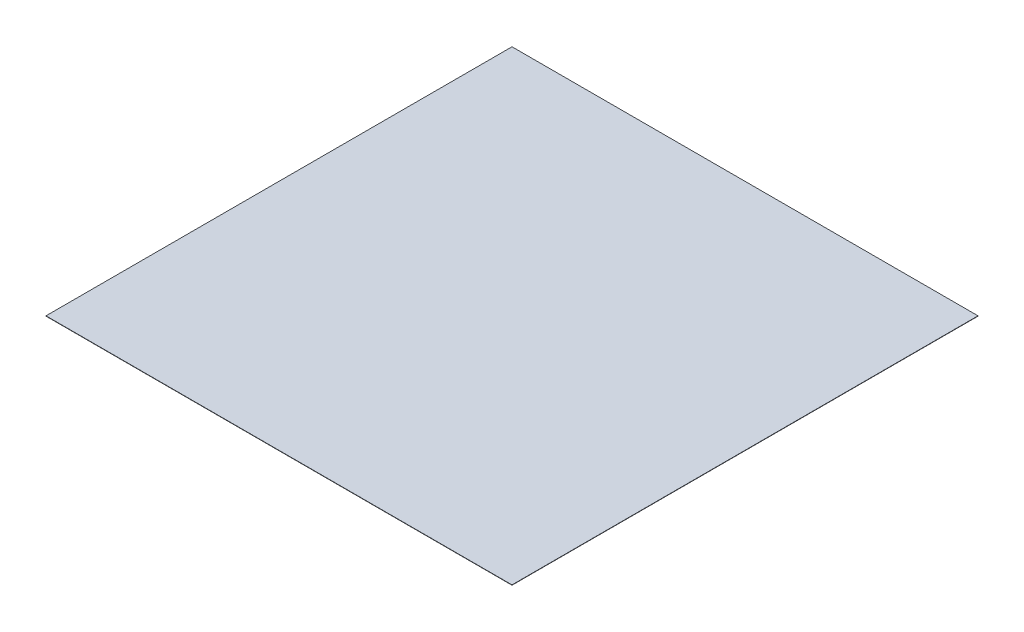
ISO-10303-21;
HEADER;
FILE_DESCRIPTION(('STEP AP214'),'2;1');
FILE_NAME('part.step','',(''),(''),'','','');
FILE_SCHEMA(('AUTOMOTIVE_DESIGN { 1 0 10303 214 1 1 1 1 }'));
ENDSEC;
DATA;
#1=APPLICATION_CONTEXT('core data for automotive mechanical design processes');
#2=APPLICATION_PROTOCOL_DEFINITION('international standard','automotive_design',2000,#1);
#3=PRODUCT_CONTEXT('',#1,'mechanical');
#4=PRODUCT('Part','Part','',(#3));
#5=PRODUCT_RELATED_PRODUCT_CATEGORY('part','',(#4));
#6=PRODUCT_DEFINITION_FORMATION('','',#4);
#7=PRODUCT_DEFINITION_CONTEXT('part definition',#1,'design');
#8=PRODUCT_DEFINITION('design','',#6,#7);
#9=PRODUCT_DEFINITION_SHAPE('','',#8);
#10=(LENGTH_UNIT() NAMED_UNIT(*) SI_UNIT(.MILLI.,.METRE.));
#11=(NAMED_UNIT(*) PLANE_ANGLE_UNIT() SI_UNIT($,.RADIAN.));
#12=(NAMED_UNIT(*) SI_UNIT($,.STERADIAN.) SOLID_ANGLE_UNIT());
#13=UNCERTAINTY_MEASURE_WITH_UNIT(LENGTH_MEASURE(1.E-05),#10,'distance_accuracy_value','');
#14=(GEOMETRIC_REPRESENTATION_CONTEXT(3) GLOBAL_UNCERTAINTY_ASSIGNED_CONTEXT((#13)) GLOBAL_UNIT_ASSIGNED_CONTEXT((#10,
#11,#12)) REPRESENTATION_CONTEXT('',''));
#15=CARTESIAN_POINT('',(0.,0.,0.));
#16=DIRECTION('',(0.,0.,1.));
#17=DIRECTION('',(1.,0.,0.));
#18=AXIS2_PLACEMENT_3D('',#15,#16,#17);
#19=CARTESIAN_POINT('',(47.625,0.065,47.625));
#20=DIRECTION('',(-1.,0.,0.));
#21=DIRECTION('',(0.,0.,1.));
#22=AXIS2_PLACEMENT_3D('',#19,#20,#21);
#23=PLANE('',#22);
#24=DIRECTION('',(0.,0.,-1.));
#25=VECTOR('',#24,1.);
#26=CARTESIAN_POINT('',(47.625,0.,47.625));
#27=LINE('',#26,#25);
#28=CARTESIAN_POINT('',(47.625,0.,47.625));
#29=VERTEX_POINT('',#28);
#30=CARTESIAN_POINT('',(47.625,0.,-47.625));
#31=VERTEX_POINT('',#30);
#32=EDGE_CURVE('E95',#29,#31,#27,.T.);
#33=ORIENTED_EDGE('',*,*,#32,.T.);
#34=DIRECTION('',(0.,-1.,0.));
#35=VECTOR('',#34,1.);
#36=CARTESIAN_POINT('',(47.625,0.065,-47.625));
#37=LINE('',#36,#35);
#38=CARTESIAN_POINT('',(47.625,0.065,-47.625));
#39=VERTEX_POINT('',#38);
#40=EDGE_CURVE('E11',#39,#31,#37,.T.);
#41=ORIENTED_EDGE('',*,*,#40,.F.);
#42=DIRECTION('',(0.,0.,-1.));
#43=VECTOR('',#42,1.);
#44=CARTESIAN_POINT('',(47.625,0.065,47.625));
#45=LINE('',#44,#43);
#46=CARTESIAN_POINT('',(47.625,0.065,47.625));
#47=VERTEX_POINT('',#46);
#48=EDGE_CURVE('E83',#47,#39,#45,.T.);
#49=ORIENTED_EDGE('',*,*,#48,.F.);
#50=DIRECTION('',(0.,-1.,0.));
#51=VECTOR('',#50,1.);
#52=CARTESIAN_POINT('',(47.625,0.065,47.625));
#53=LINE('',#52,#51);
#54=EDGE_CURVE('E91',#47,#29,#53,.T.);
#55=ORIENTED_EDGE('',*,*,#54,.T.);
#56=EDGE_LOOP('',(#33,#41,#49,#55));
#57=FACE_BOUND('',#56,.T.);
#58=ADVANCED_FACE('F32',(#57),#23,.F.);
#59=CARTESIAN_POINT('',(-47.625,0.065,-47.625));
#60=DIRECTION('',(0.,0.,1.));
#61=DIRECTION('',(1.,0.,0.));
#62=AXIS2_PLACEMENT_3D('',#59,#60,#61);
#63=PLANE('',#62);
#64=DIRECTION('',(-1.,0.,0.));
#65=VECTOR('',#64,1.);
#66=CARTESIAN_POINT('',(-47.625,0.,-47.625));
#67=LINE('',#66,#65);
#68=CARTESIAN_POINT('',(-47.625,0.,-47.625));
#69=VERTEX_POINT('',#68);
#70=EDGE_CURVE('E87',#31,#69,#67,.T.);
#71=ORIENTED_EDGE('',*,*,#70,.T.);
#72=DIRECTION('',(0.,-1.,0.));
#73=VECTOR('',#72,1.);
#74=CARTESIAN_POINT('',(-47.625,0.065,-47.625));
#75=LINE('',#74,#73);
#76=CARTESIAN_POINT('',(-47.625,0.065,-47.625));
#77=VERTEX_POINT('',#76);
#78=EDGE_CURVE('E40',#77,#69,#75,.T.);
#79=ORIENTED_EDGE('',*,*,#78,.F.);
#80=DIRECTION('',(-1.,0.,0.));
#81=VECTOR('',#80,1.);
#82=CARTESIAN_POINT('',(-47.625,0.065,-47.625));
#83=LINE('',#82,#81);
#84=EDGE_CURVE('E78',#39,#77,#83,.T.);
#85=ORIENTED_EDGE('',*,*,#84,.F.);
#86=ORIENTED_EDGE('',*,*,#40,.T.);
#87=EDGE_LOOP('',(#71,#79,#85,#86));
#88=FACE_BOUND('',#87,.T.);
#89=ADVANCED_FACE('F86',(#88),#63,.F.);
#90=CARTESIAN_POINT('',(-47.625,0.065,47.625));
#91=DIRECTION('',(1.,0.,0.));
#92=DIRECTION('',(0.,0.,-1.));
#93=AXIS2_PLACEMENT_3D('',#90,#91,#92);
#94=PLANE('',#93);
#95=DIRECTION('',(0.,0.,1.));
#96=VECTOR('',#95,1.);
#97=CARTESIAN_POINT('',(-47.625,0.,47.625));
#98=LINE('',#97,#96);
#99=CARTESIAN_POINT('',(-47.625,0.,47.625));
#100=VERTEX_POINT('',#99);
#101=EDGE_CURVE('E65',#69,#100,#98,.T.);
#102=ORIENTED_EDGE('',*,*,#101,.T.);
#103=DIRECTION('',(0.,-1.,0.));
#104=VECTOR('',#103,1.);
#105=CARTESIAN_POINT('',(-47.625,0.065,47.625));
#106=LINE('',#105,#104);
#107=CARTESIAN_POINT('',(-47.625,0.065,47.625));
#108=VERTEX_POINT('',#107);
#109=EDGE_CURVE('E88',#108,#100,#106,.T.);
#110=ORIENTED_EDGE('',*,*,#109,.F.);
#111=DIRECTION('',(0.,0.,1.));
#112=VECTOR('',#111,1.);
#113=CARTESIAN_POINT('',(-47.625,0.065,47.625));
#114=LINE('',#113,#112);
#115=EDGE_CURVE('E81',#77,#108,#114,.T.);
#116=ORIENTED_EDGE('',*,*,#115,.F.);
#117=ORIENTED_EDGE('',*,*,#78,.T.);
#118=EDGE_LOOP('',(#102,#110,#116,#117));
#119=FACE_BOUND('',#118,.T.);
#120=ADVANCED_FACE('F89',(#119),#94,.F.);
#121=CARTESIAN_POINT('',(-47.625,0.065,47.625));
#122=DIRECTION('',(0.,0.,-1.));
#123=DIRECTION('',(-1.,0.,0.));
#124=AXIS2_PLACEMENT_3D('',#121,#122,#123);
#125=PLANE('',#124);
#126=DIRECTION('',(1.,0.,0.));
#127=VECTOR('',#126,1.);
#128=CARTESIAN_POINT('',(-47.625,0.,47.625));
#129=LINE('',#128,#127);
#130=EDGE_CURVE('E71',#100,#29,#129,.T.);
#131=ORIENTED_EDGE('',*,*,#130,.T.);
#132=ORIENTED_EDGE('',*,*,#54,.F.);
#133=DIRECTION('',(1.,0.,0.));
#134=VECTOR('',#133,1.);
#135=CARTESIAN_POINT('',(-47.625,0.065,47.625));
#136=LINE('',#135,#134);
#137=EDGE_CURVE('E48',#108,#47,#136,.T.);
#138=ORIENTED_EDGE('',*,*,#137,.F.);
#139=ORIENTED_EDGE('',*,*,#109,.T.);
#140=EDGE_LOOP('',(#131,#132,#138,#139));
#141=FACE_BOUND('',#140,.T.);
#142=ADVANCED_FACE('F102',(#141),#125,.F.);
#143=CARTESIAN_POINT('',(0.,0.065,0.));
#144=DIRECTION('',(0.,-1.,0.));
#145=DIRECTION('',(0.,0.,-1.));
#146=AXIS2_PLACEMENT_3D('',#143,#144,#145);
#147=PLANE('',#146);
#148=ORIENTED_EDGE('',*,*,#48,.T.);
#149=ORIENTED_EDGE('',*,*,#84,.T.);
#150=ORIENTED_EDGE('',*,*,#115,.T.);
#151=ORIENTED_EDGE('',*,*,#137,.T.);
#152=EDGE_LOOP('',(#148,#149,#150,#151));
#153=FACE_BOUND('',#152,.T.);
#154=ADVANCED_FACE('F79',(#153),#147,.F.);
#155=CARTESIAN_POINT('',(0.,0.,0.));
#156=DIRECTION('',(0.,-1.,0.));
#157=DIRECTION('',(0.,0.,-1.));
#158=AXIS2_PLACEMENT_3D('',#155,#156,#157);
#159=PLANE('',#158);
#160=ORIENTED_EDGE('',*,*,#32,.F.);
#161=ORIENTED_EDGE('',*,*,#130,.F.);
#162=ORIENTED_EDGE('',*,*,#101,.F.);
#163=ORIENTED_EDGE('',*,*,#70,.F.);
#164=EDGE_LOOP('',(#160,#161,#162,#163));
#165=FACE_BOUND('',#164,.T.);
#166=ADVANCED_FACE('F105',(#165),#159,.T.);
#167=CLOSED_SHELL('',(#58,#89,#120,#142,#154,#166));
#168=MANIFOLD_SOLID_BREP('B2',#167);
#169=ADVANCED_BREP_SHAPE_REPRESENTATION('',(#18,#168),#14);
#170=SHAPE_DEFINITION_REPRESENTATION(#9,#169);
ENDSEC;
END-ISO-10303-21;
